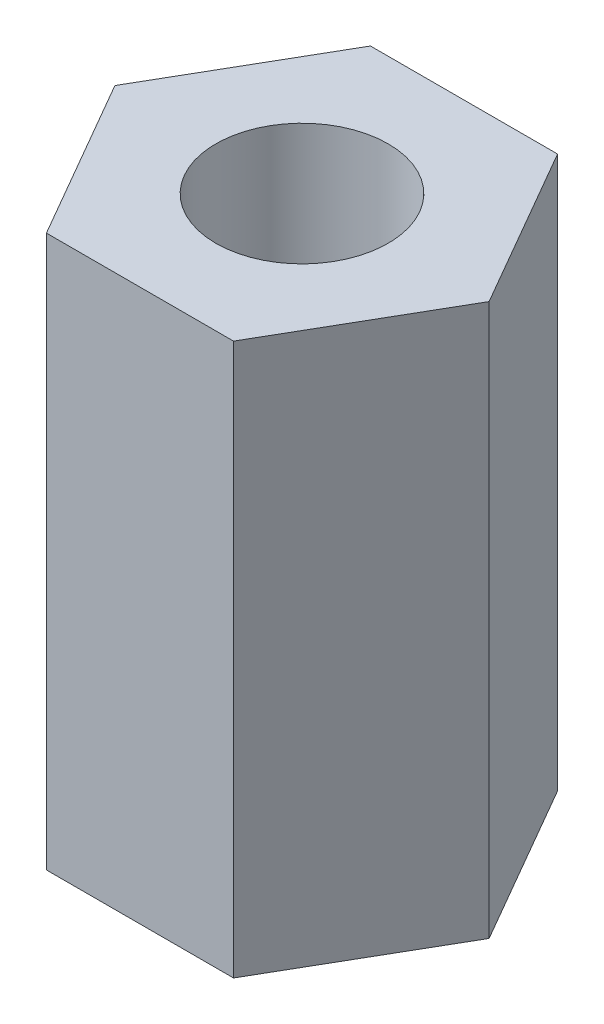
ISO-10303-21;
HEADER;
FILE_DESCRIPTION(('STEP AP214'),'2;1');
FILE_NAME('part.step','',(''),(''),'','','');
FILE_SCHEMA(('AUTOMOTIVE_DESIGN { 1 0 10303 214 1 1 1 1 }'));
ENDSEC;
DATA;
#1=APPLICATION_CONTEXT('core data for automotive mechanical design processes');
#2=APPLICATION_PROTOCOL_DEFINITION('international standard','automotive_design',2000,#1);
#3=PRODUCT_CONTEXT('',#1,'mechanical');
#4=PRODUCT('Part','Part','',(#3));
#5=PRODUCT_RELATED_PRODUCT_CATEGORY('part','',(#4));
#6=PRODUCT_DEFINITION_FORMATION('','',#4);
#7=PRODUCT_DEFINITION_CONTEXT('part definition',#1,'design');
#8=PRODUCT_DEFINITION('design','',#6,#7);
#9=PRODUCT_DEFINITION_SHAPE('','',#8);
#10=(LENGTH_UNIT() NAMED_UNIT(*) SI_UNIT(.MILLI.,.METRE.));
#11=(NAMED_UNIT(*) PLANE_ANGLE_UNIT() SI_UNIT($,.RADIAN.));
#12=(NAMED_UNIT(*) SI_UNIT($,.STERADIAN.) SOLID_ANGLE_UNIT());
#13=UNCERTAINTY_MEASURE_WITH_UNIT(LENGTH_MEASURE(1.E-05),#10,'distance_accuracy_value','');
#14=(GEOMETRIC_REPRESENTATION_CONTEXT(3) GLOBAL_UNCERTAINTY_ASSIGNED_CONTEXT((#13)) GLOBAL_UNIT_ASSIGNED_CONTEXT((#10,
#11,#12)) REPRESENTATION_CONTEXT('',''));
#15=CARTESIAN_POINT('',(0.,0.,0.));
#16=DIRECTION('',(0.,0.,1.));
#17=DIRECTION('',(1.,0.,0.));
#18=AXIS2_PLACEMENT_3D('',#15,#16,#17);
#19=CARTESIAN_POINT('',(0.,8.,0.));
#20=DIRECTION('',(0.,1.,0.));
#21=DIRECTION('',(0.,0.,1.));
#22=AXIS2_PLACEMENT_3D('',#19,#20,#21);
#23=PLANE('',#22);
#24=DIRECTION('',(0.499999999999995,0.,-0.866025403784441));
#25=VECTOR('',#24,1.);
#26=CARTESIAN_POINT('',(1.35677313259565,8.,2.34999999999999));
#27=LINE('',#26,#25);
#28=CARTESIAN_POINT('',(1.35677313259565,8.,2.34999999999999));
#29=VERTEX_POINT('',#28);
#30=CARTESIAN_POINT('',(2.71354626519124,8.,0.));
#31=VERTEX_POINT('',#30);
#32=EDGE_CURVE('E135',#29,#31,#27,.T.);
#33=ORIENTED_EDGE('',*,*,#32,.T.);
#34=DIRECTION('',(-0.500000000000001,0.,-0.866025403784438));
#35=VECTOR('',#34,1.);
#36=CARTESIAN_POINT('',(2.71354626519124,8.,0.));
#37=LINE('',#36,#35);
#38=CARTESIAN_POINT('',(1.35677313259562,8.,-2.35));
#39=VERTEX_POINT('',#38);
#40=EDGE_CURVE('E93',#31,#39,#37,.T.);
#41=ORIENTED_EDGE('',*,*,#40,.T.);
#42=DIRECTION('',(-1.,0.,0.));
#43=VECTOR('',#42,1.);
#44=CARTESIAN_POINT('',(1.35677313259562,8.,-2.35));
#45=LINE('',#44,#43);
#46=CARTESIAN_POINT('',(-1.35677313259563,8.,-2.35));
#47=VERTEX_POINT('',#46);
#48=EDGE_CURVE('E106',#39,#47,#45,.T.);
#49=ORIENTED_EDGE('',*,*,#48,.T.);
#50=DIRECTION('',(-0.499999999999995,0.,0.866025403784441));
#51=VECTOR('',#50,1.);
#52=CARTESIAN_POINT('',(-1.35677313259563,8.,-2.35));
#53=LINE('',#52,#51);
#54=CARTESIAN_POINT('',(-2.71354626519124,8.,0.));
#55=VERTEX_POINT('',#54);
#56=EDGE_CURVE('E100',#47,#55,#53,.T.);
#57=ORIENTED_EDGE('',*,*,#56,.T.);
#58=DIRECTION('',(0.500000000000007,0.,0.866025403784435));
#59=VECTOR('',#58,1.);
#60=CARTESIAN_POINT('',(-2.71354626519124,8.,0.));
#61=LINE('',#60,#59);
#62=CARTESIAN_POINT('',(-1.3567731325956,8.,2.35000000000001));
#63=VERTEX_POINT('',#62);
#64=EDGE_CURVE('E104',#55,#63,#61,.T.);
#65=ORIENTED_EDGE('',*,*,#64,.T.);
#66=DIRECTION('',(1.,0.,0.));
#67=VECTOR('',#66,1.);
#68=CARTESIAN_POINT('',(-1.3567731325956,8.,2.35000000000001));
#69=LINE('',#68,#67);
#70=EDGE_CURVE('E56',#63,#29,#69,.T.);
#71=ORIENTED_EDGE('',*,*,#70,.T.);
#72=EDGE_LOOP('',(#33,#41,#49,#57,#65,#71));
#73=FACE_BOUND('',#72,.T.);
#74=CARTESIAN_POINT('',(0.,8.,0.));
#75=DIRECTION('',(0.,1.,0.));
#76=DIRECTION('',(0.,0.,1.));
#77=AXIS2_PLACEMENT_3D('',#74,#75,#76);
#78=CIRCLE('',#77,1.25);
#79=CARTESIAN_POINT('',(0.,8.,1.25));
#80=VERTEX_POINT('',#79);
#81=EDGE_CURVE('E128',#80,#80,#78,.T.);
#82=ORIENTED_EDGE('',*,*,#81,.F.);
#83=EDGE_LOOP('',(#82));
#84=FACE_BOUND('',#83,.T.);
#85=ADVANCED_FACE('F39',(#73,#84),#23,.T.);
#86=CARTESIAN_POINT('',(0.,0.,0.));
#87=DIRECTION('',(0.,1.,0.));
#88=DIRECTION('',(0.,0.,1.));
#89=AXIS2_PLACEMENT_3D('',#86,#87,#88);
#90=PLANE('',#89);
#91=DIRECTION('',(0.499999999999995,0.,-0.866025403784441));
#92=VECTOR('',#91,1.);
#93=CARTESIAN_POINT('',(1.35677313259565,0.,2.34999999999999));
#94=LINE('',#93,#92);
#95=CARTESIAN_POINT('',(1.35677313259565,0.,2.34999999999999));
#96=VERTEX_POINT('',#95);
#97=CARTESIAN_POINT('',(2.71354626519124,0.,0.));
#98=VERTEX_POINT('',#97);
#99=EDGE_CURVE('E124',#96,#98,#94,.T.);
#100=ORIENTED_EDGE('',*,*,#99,.F.);
#101=DIRECTION('',(1.,0.,0.));
#102=VECTOR('',#101,1.);
#103=CARTESIAN_POINT('',(-1.3567731325956,0.,2.35000000000001));
#104=LINE('',#103,#102);
#105=CARTESIAN_POINT('',(-1.3567731325956,0.,2.35000000000001));
#106=VERTEX_POINT('',#105);
#107=EDGE_CURVE('E85',#106,#96,#104,.T.);
#108=ORIENTED_EDGE('',*,*,#107,.F.);
#109=DIRECTION('',(0.500000000000007,0.,0.866025403784435));
#110=VECTOR('',#109,1.);
#111=CARTESIAN_POINT('',(-2.71354626519124,0.,0.));
#112=LINE('',#111,#110);
#113=CARTESIAN_POINT('',(-2.71354626519124,0.,0.));
#114=VERTEX_POINT('',#113);
#115=EDGE_CURVE('E79',#114,#106,#112,.T.);
#116=ORIENTED_EDGE('',*,*,#115,.F.);
#117=DIRECTION('',(-0.499999999999995,0.,0.866025403784441));
#118=VECTOR('',#117,1.);
#119=CARTESIAN_POINT('',(-1.35677313259563,0.,-2.35));
#120=LINE('',#119,#118);
#121=CARTESIAN_POINT('',(-1.35677313259563,0.,-2.35));
#122=VERTEX_POINT('',#121);
#123=EDGE_CURVE('E114',#122,#114,#120,.T.);
#124=ORIENTED_EDGE('',*,*,#123,.F.);
#125=DIRECTION('',(-1.,0.,0.));
#126=VECTOR('',#125,1.);
#127=CARTESIAN_POINT('',(1.35677313259562,0.,-2.35));
#128=LINE('',#127,#126);
#129=CARTESIAN_POINT('',(1.35677313259562,0.,-2.35));
#130=VERTEX_POINT('',#129);
#131=EDGE_CURVE('E130',#130,#122,#128,.T.);
#132=ORIENTED_EDGE('',*,*,#131,.F.);
#133=DIRECTION('',(-0.500000000000001,0.,-0.866025403784438));
#134=VECTOR('',#133,1.);
#135=CARTESIAN_POINT('',(2.71354626519124,0.,0.));
#136=LINE('',#135,#134);
#137=EDGE_CURVE('E127',#98,#130,#136,.T.);
#138=ORIENTED_EDGE('',*,*,#137,.F.);
#139=EDGE_LOOP('',(#100,#108,#116,#124,#132,#138));
#140=FACE_BOUND('',#139,.T.);
#141=CARTESIAN_POINT('',(0.,0.,0.));
#142=DIRECTION('',(0.,1.,0.));
#143=DIRECTION('',(0.,0.,1.));
#144=AXIS2_PLACEMENT_3D('',#141,#142,#143);
#145=CIRCLE('',#144,1.25);
#146=CARTESIAN_POINT('',(0.,0.,1.25));
#147=VERTEX_POINT('',#146);
#148=EDGE_CURVE('E228',#147,#147,#145,.T.);
#149=ORIENTED_EDGE('',*,*,#148,.T.);
#150=EDGE_LOOP('',(#149));
#151=FACE_BOUND('',#150,.T.);
#152=ADVANCED_FACE('F144',(#140,#151),#90,.F.);
#153=CARTESIAN_POINT('',(1.35677313259565,8.,2.34999999999999));
#154=DIRECTION('',(-0.866025403784441,0.,-0.499999999999995));
#155=DIRECTION('',(-0.499999999999995,0.,0.866025403784441));
#156=AXIS2_PLACEMENT_3D('',#153,#154,#155);
#157=PLANE('',#156);
#158=ORIENTED_EDGE('',*,*,#99,.T.);
#159=DIRECTION('',(0.,-1.,0.));
#160=VECTOR('',#159,1.);
#161=CARTESIAN_POINT('',(2.71354626519124,8.,0.));
#162=LINE('',#161,#160);
#163=EDGE_CURVE('E11',#31,#98,#162,.T.);
#164=ORIENTED_EDGE('',*,*,#163,.F.);
#165=ORIENTED_EDGE('',*,*,#32,.F.);
#166=DIRECTION('',(0.,-1.,0.));
#167=VECTOR('',#166,1.);
#168=CARTESIAN_POINT('',(1.35677313259565,8.,2.34999999999999));
#169=LINE('',#168,#167);
#170=EDGE_CURVE('E120',#29,#96,#169,.T.);
#171=ORIENTED_EDGE('',*,*,#170,.T.);
#172=EDGE_LOOP('',(#158,#164,#165,#171));
#173=FACE_BOUND('',#172,.T.);
#174=ADVANCED_FACE('F41',(#173),#157,.F.);
#175=CARTESIAN_POINT('',(2.71354626519124,8.,0.));
#176=DIRECTION('',(-0.866025403784438,0.,0.500000000000001));
#177=DIRECTION('',(0.500000000000001,0.,0.866025403784438));
#178=AXIS2_PLACEMENT_3D('',#175,#176,#177);
#179=PLANE('',#178);
#180=ORIENTED_EDGE('',*,*,#137,.T.);
#181=DIRECTION('',(0.,-1.,0.));
#182=VECTOR('',#181,1.);
#183=CARTESIAN_POINT('',(1.35677313259562,8.,-2.35));
#184=LINE('',#183,#182);
#185=EDGE_CURVE('E48',#39,#130,#184,.T.);
#186=ORIENTED_EDGE('',*,*,#185,.F.);
#187=ORIENTED_EDGE('',*,*,#40,.F.);
#188=ORIENTED_EDGE('',*,*,#163,.T.);
#189=EDGE_LOOP('',(#180,#186,#187,#188));
#190=FACE_BOUND('',#189,.T.);
#191=ADVANCED_FACE('F169',(#190),#179,.F.);
#192=CARTESIAN_POINT('',(1.35677313259562,8.,-2.35));
#193=DIRECTION('',(0.,0.,1.));
#194=DIRECTION('',(1.,0.,0.));
#195=AXIS2_PLACEMENT_3D('',#192,#193,#194);
#196=PLANE('',#195);
#197=ORIENTED_EDGE('',*,*,#131,.T.);
#198=DIRECTION('',(0.,-1.,0.));
#199=VECTOR('',#198,1.);
#200=CARTESIAN_POINT('',(-1.35677313259563,8.,-2.35));
#201=LINE('',#200,#199);
#202=EDGE_CURVE('E115',#47,#122,#201,.T.);
#203=ORIENTED_EDGE('',*,*,#202,.F.);
#204=ORIENTED_EDGE('',*,*,#48,.F.);
#205=ORIENTED_EDGE('',*,*,#185,.T.);
#206=EDGE_LOOP('',(#197,#203,#204,#205));
#207=FACE_BOUND('',#206,.T.);
#208=ADVANCED_FACE('F141',(#207),#196,.F.);
#209=CARTESIAN_POINT('',(-1.35677313259563,8.,-2.35));
#210=DIRECTION('',(0.866025403784442,0.,0.499999999999995));
#211=DIRECTION('',(0.499999999999995,0.,-0.866025403784442));
#212=AXIS2_PLACEMENT_3D('',#209,#210,#211);
#213=PLANE('',#212);
#214=ORIENTED_EDGE('',*,*,#123,.T.);
#215=DIRECTION('',(0.,-1.,0.));
#216=VECTOR('',#215,1.);
#217=CARTESIAN_POINT('',(-2.71354626519124,8.,0.));
#218=LINE('',#217,#216);
#219=EDGE_CURVE('E111',#55,#114,#218,.T.);
#220=ORIENTED_EDGE('',*,*,#219,.F.);
#221=ORIENTED_EDGE('',*,*,#56,.F.);
#222=ORIENTED_EDGE('',*,*,#202,.T.);
#223=EDGE_LOOP('',(#214,#220,#221,#222));
#224=FACE_BOUND('',#223,.T.);
#225=ADVANCED_FACE('F112',(#224),#213,.F.);
#226=CARTESIAN_POINT('',(-2.71354626519124,8.,0.));
#227=DIRECTION('',(0.866025403784434,0.,-0.500000000000007));
#228=DIRECTION('',(-0.500000000000007,0.,-0.866025403784435));
#229=AXIS2_PLACEMENT_3D('',#226,#227,#228);
#230=PLANE('',#229);
#231=ORIENTED_EDGE('',*,*,#115,.T.);
#232=DIRECTION('',(0.,-1.,0.));
#233=VECTOR('',#232,1.);
#234=CARTESIAN_POINT('',(-1.3567731325956,8.,2.35000000000001));
#235=LINE('',#234,#233);
#236=EDGE_CURVE('E116',#63,#106,#235,.T.);
#237=ORIENTED_EDGE('',*,*,#236,.F.);
#238=ORIENTED_EDGE('',*,*,#64,.F.);
#239=ORIENTED_EDGE('',*,*,#219,.T.);
#240=EDGE_LOOP('',(#231,#237,#238,#239));
#241=FACE_BOUND('',#240,.T.);
#242=ADVANCED_FACE('F118',(#241),#230,.F.);
#243=CARTESIAN_POINT('',(-1.3567731325956,8.,2.35000000000001));
#244=DIRECTION('',(0.,0.,-1.));
#245=DIRECTION('',(-1.,0.,0.));
#246=AXIS2_PLACEMENT_3D('',#243,#244,#245);
#247=PLANE('',#246);
#248=ORIENTED_EDGE('',*,*,#107,.T.);
#249=ORIENTED_EDGE('',*,*,#170,.F.);
#250=ORIENTED_EDGE('',*,*,#70,.F.);
#251=ORIENTED_EDGE('',*,*,#236,.T.);
#252=EDGE_LOOP('',(#248,#249,#250,#251));
#253=FACE_BOUND('',#252,.T.);
#254=ADVANCED_FACE('F149',(#253),#247,.F.);
#255=CARTESIAN_POINT('',(0.,8.,0.));
#256=DIRECTION('',(0.,-1.,0.));
#257=DIRECTION('',(0.,0.,-1.));
#258=AXIS2_PLACEMENT_3D('',#255,#256,#257);
#259=CYLINDRICAL_SURFACE('',#258,1.25);
#260=ORIENTED_EDGE('',*,*,#81,.T.);
#261=EDGE_LOOP('',(#260));
#262=FACE_BOUND('',#261,.T.);
#263=ORIENTED_EDGE('',*,*,#148,.F.);
#264=EDGE_LOOP('',(#263));
#265=FACE_BOUND('',#264,.T.);
#266=ADVANCED_FACE('F151',(#262,#265),#259,.F.);
#267=CLOSED_SHELL('',(#85,#152,#174,#191,#208,#225,#242,#254,#266));
#268=MANIFOLD_SOLID_BREP('B2',#267);
#269=ADVANCED_BREP_SHAPE_REPRESENTATION('',(#18,#268),#14);
#270=SHAPE_DEFINITION_REPRESENTATION(#9,#269);
ENDSEC;
END-ISO-10303-21;
